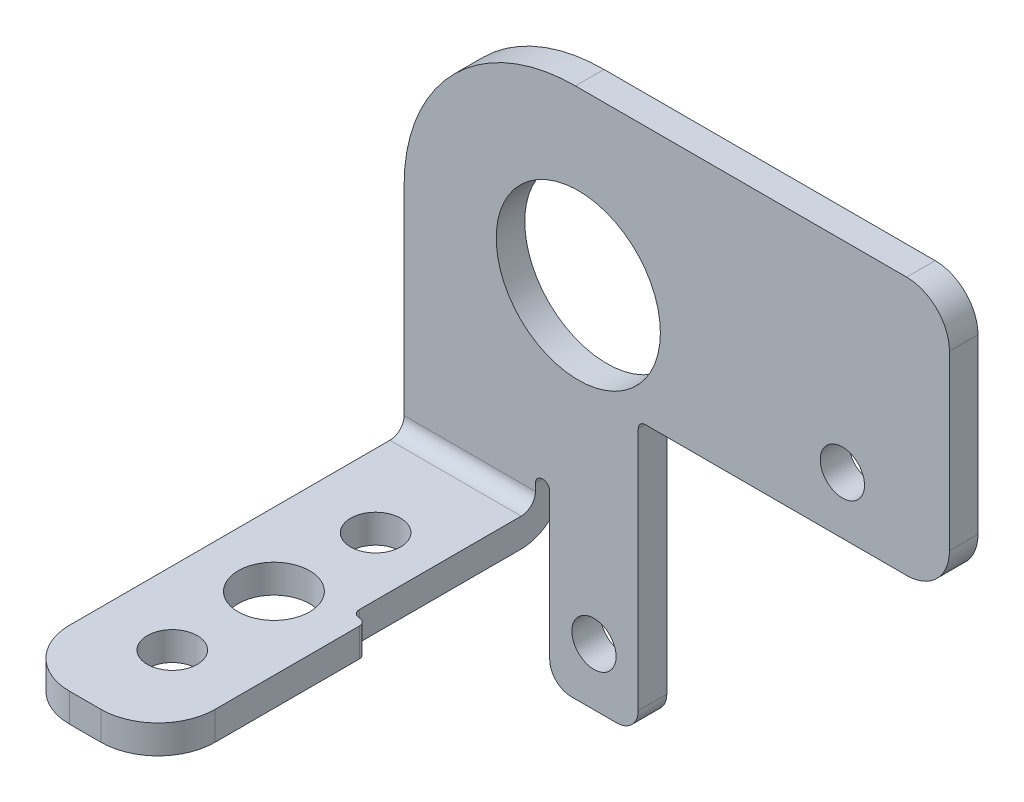
ISO-10303-21;
HEADER;
FILE_DESCRIPTION(('STEP AP214'),'2;1');
FILE_NAME('part.step','',(''),(''),'','','');
FILE_SCHEMA(('AUTOMOTIVE_DESIGN { 1 0 10303 214 1 1 1 1 }'));
ENDSEC;
DATA;
#1=APPLICATION_CONTEXT('core data for automotive mechanical design processes');
#2=APPLICATION_PROTOCOL_DEFINITION('international standard','automotive_design',2000,#1);
#3=PRODUCT_CONTEXT('',#1,'mechanical');
#4=PRODUCT('Part','Part','',(#3));
#5=PRODUCT_RELATED_PRODUCT_CATEGORY('part','',(#4));
#6=PRODUCT_DEFINITION_FORMATION('','',#4);
#7=PRODUCT_DEFINITION_CONTEXT('part definition',#1,'design');
#8=PRODUCT_DEFINITION('design','',#6,#7);
#9=PRODUCT_DEFINITION_SHAPE('','',#8);
#10=(LENGTH_UNIT() NAMED_UNIT(*) SI_UNIT(.MILLI.,.METRE.));
#11=(NAMED_UNIT(*) PLANE_ANGLE_UNIT() SI_UNIT($,.RADIAN.));
#12=(NAMED_UNIT(*) SI_UNIT($,.STERADIAN.) SOLID_ANGLE_UNIT());
#13=UNCERTAINTY_MEASURE_WITH_UNIT(LENGTH_MEASURE(1.E-05),#10,'distance_accuracy_value','');
#14=(GEOMETRIC_REPRESENTATION_CONTEXT(3) GLOBAL_UNCERTAINTY_ASSIGNED_CONTEXT((#13)) GLOBAL_UNIT_ASSIGNED_CONTEXT((#10,
#11,#12)) REPRESENTATION_CONTEXT('',''));
#15=CARTESIAN_POINT('',(0.,0.,0.));
#16=DIRECTION('',(0.,0.,1.));
#17=DIRECTION('',(1.,0.,0.));
#18=AXIS2_PLACEMENT_3D('',#15,#16,#17);
#19=CARTESIAN_POINT('',(0.,-18.1,2.));
#20=DIRECTION('',(-1.,0.,0.));
#21=DIRECTION('',(0.,0.,1.));
#22=AXIS2_PLACEMENT_3D('',#19,#20,#21);
#23=PLANE('',#22);
#24=DIRECTION('',(0.,1.,0.));
#25=VECTOR('',#24,1.);
#26=CARTESIAN_POINT('',(0.,-18.1,2.));
#27=LINE('',#26,#25);
#28=CARTESIAN_POINT('',(0.,-15.1,2.));
#29=VERTEX_POINT('',#28);
#30=CARTESIAN_POINT('',(0.,-3.,2.));
#31=VERTEX_POINT('',#30);
#32=EDGE_CURVE('E261',#29,#31,#27,.T.);
#33=ORIENTED_EDGE('',*,*,#32,.F.);
#34=DIRECTION('',(0.,0.,-1.));
#35=VECTOR('',#34,1.);
#36=CARTESIAN_POINT('',(0.,-15.1,2.));
#37=LINE('',#36,#35);
#38=CARTESIAN_POINT('',(0.,-15.1,0.));
#39=VERTEX_POINT('',#38);
#40=EDGE_CURVE('E323',#29,#39,#37,.T.);
#41=ORIENTED_EDGE('',*,*,#40,.T.);
#42=DIRECTION('',(0.,1.,0.));
#43=VECTOR('',#42,1.);
#44=CARTESIAN_POINT('',(0.,-18.1,0.));
#45=LINE('',#44,#43);
#46=CARTESIAN_POINT('',(0.,-3.,0.));
#47=VERTEX_POINT('',#46);
#48=EDGE_CURVE('E249',#39,#47,#45,.T.);
#49=ORIENTED_EDGE('',*,*,#48,.T.);
#50=DIRECTION('',(0.,0.,-1.));
#51=VECTOR('',#50,1.);
#52=CARTESIAN_POINT('',(0.,-3.,2.));
#53=LINE('',#52,#51);
#54=EDGE_CURVE('E293',#47,#31,#53,.F.);
#55=ORIENTED_EDGE('',*,*,#54,.T.);
#56=EDGE_LOOP('',(#33,#41,#49,#55));
#57=FACE_BOUND('',#56,.T.);
#58=ADVANCED_FACE('F38',(#57),#23,.F.);
#59=CARTESIAN_POINT('',(0.,0.,2.));
#60=DIRECTION('',(0.,-1.,0.));
#61=DIRECTION('',(1.,0.,0.));
#62=AXIS2_PLACEMENT_3D('',#59,#60,#61);
#63=PLANE('',#62);
#64=DIRECTION('',(-1.,0.,0.));
#65=VECTOR('',#64,1.);
#66=CARTESIAN_POINT('',(0.,0.,0.));
#67=LINE('',#66,#65);
#68=CARTESIAN_POINT('',(-3.,0.,0.));
#69=VERTEX_POINT('',#68);
#70=CARTESIAN_POINT('',(-26.2,0.,0.));
#71=VERTEX_POINT('',#70);
#72=EDGE_CURVE('E297',#69,#71,#67,.T.);
#73=ORIENTED_EDGE('',*,*,#72,.T.);
#74=DIRECTION('',(0.,0.,-1.));
#75=VECTOR('',#74,1.);
#76=CARTESIAN_POINT('',(-26.2,0.,2.));
#77=LINE('',#76,#75);
#78=CARTESIAN_POINT('',(-26.2,0.,2.));
#79=VERTEX_POINT('',#78);
#80=EDGE_CURVE('E355',#71,#79,#77,.F.);
#81=ORIENTED_EDGE('',*,*,#80,.T.);
#82=DIRECTION('',(-1.,0.,0.));
#83=VECTOR('',#82,1.);
#84=CARTESIAN_POINT('',(0.,0.,2.));
#85=LINE('',#84,#83);
#86=CARTESIAN_POINT('',(-3.,0.,2.));
#87=VERTEX_POINT('',#86);
#88=EDGE_CURVE('E265',#87,#79,#85,.T.);
#89=ORIENTED_EDGE('',*,*,#88,.F.);
#90=DIRECTION('',(0.,0.,-1.));
#91=VECTOR('',#90,1.);
#92=CARTESIAN_POINT('',(-3.,0.,2.));
#93=LINE('',#92,#91);
#94=EDGE_CURVE('E344',#87,#69,#93,.T.);
#95=ORIENTED_EDGE('',*,*,#94,.T.);
#96=EDGE_LOOP('',(#73,#81,#89,#95));
#97=FACE_BOUND('',#96,.T.);
#98=ADVANCED_FACE('F494',(#97),#63,.F.);
#99=CARTESIAN_POINT('',(-38.2,0.,2.));
#100=DIRECTION('',(1.,0.,0.));
#101=DIRECTION('',(0.,0.,-1.));
#102=AXIS2_PLACEMENT_3D('',#99,#100,#101);
#103=PLANE('',#102);
#104=DIRECTION('',(0.,0.,-1.));
#105=VECTOR('',#104,1.);
#106=CARTESIAN_POINT('',(-38.2,-29.,14.84));
#107=LINE('',#106,#105);
#108=CARTESIAN_POINT('',(-38.2,-29.,25.44));
#109=VERTEX_POINT('',#108);
#110=CARTESIAN_POINT('',(-38.2,-29.,3.));
#111=VERTEX_POINT('',#110);
#112=EDGE_CURVE('E225',#109,#111,#107,.T.);
#113=ORIENTED_EDGE('',*,*,#112,.F.);
#114=DIRECTION('',(0.,1.,0.));
#115=VECTOR('',#114,1.);
#116=CARTESIAN_POINT('',(-38.2,-27.,25.44));
#117=LINE('',#116,#115);
#118=CARTESIAN_POINT('',(-38.2,-27.,25.44));
#119=VERTEX_POINT('',#118);
#120=EDGE_CURVE('E432',#109,#119,#117,.T.);
#121=ORIENTED_EDGE('',*,*,#120,.T.);
#122=DIRECTION('',(0.,0.,-1.));
#123=VECTOR('',#122,1.);
#124=CARTESIAN_POINT('',(-38.2,-27.,14.84));
#125=LINE('',#124,#123);
#126=CARTESIAN_POINT('',(-38.2,-27.,2.99999999999999));
#127=VERTEX_POINT('',#126);
#128=EDGE_CURVE('E507',#119,#127,#125,.T.);
#129=ORIENTED_EDGE('',*,*,#128,.T.);
#130=CARTESIAN_POINT('',(-38.2,-26.,3.));
#131=DIRECTION('',(1.,0.,0.));
#132=DIRECTION('',(0.,0.,1.));
#133=AXIS2_PLACEMENT_3D('',#130,#131,#132);
#134=CIRCLE('',#133,0.999999999999999);
#135=CARTESIAN_POINT('',(-38.2,-26.,2.));
#136=VERTEX_POINT('',#135);
#137=EDGE_CURVE('E255',#127,#136,#134,.T.);
#138=ORIENTED_EDGE('',*,*,#137,.T.);
#139=DIRECTION('',(0.,-1.,0.));
#140=VECTOR('',#139,1.);
#141=CARTESIAN_POINT('',(-38.2,0.,2.));
#142=LINE('',#141,#140);
#143=CARTESIAN_POINT('',(-38.2,-12.,2.));
#144=VERTEX_POINT('',#143);
#145=EDGE_CURVE('E270',#144,#136,#142,.T.);
#146=ORIENTED_EDGE('',*,*,#145,.F.);
#147=DIRECTION('',(0.,0.,-1.));
#148=VECTOR('',#147,1.);
#149=CARTESIAN_POINT('',(-38.2,-12.,2.));
#150=LINE('',#149,#148);
#151=CARTESIAN_POINT('',(-38.2,-12.,0.));
#152=VERTEX_POINT('',#151);
#153=EDGE_CURVE('E348',#144,#152,#150,.T.);
#154=ORIENTED_EDGE('',*,*,#153,.T.);
#155=DIRECTION('',(0.,-1.,0.));
#156=VECTOR('',#155,1.);
#157=CARTESIAN_POINT('',(-38.2,0.,0.));
#158=LINE('',#157,#156);
#159=CARTESIAN_POINT('',(-38.2,-26.,0.));
#160=VERTEX_POINT('',#159);
#161=EDGE_CURVE('E301',#152,#160,#158,.T.);
#162=ORIENTED_EDGE('',*,*,#161,.T.);
#163=CARTESIAN_POINT('',(-38.2,-26.,3.));
#164=DIRECTION('',(-1.,0.,0.));
#165=DIRECTION('',(0.,0.,1.));
#166=AXIS2_PLACEMENT_3D('',#163,#164,#165);
#167=CIRCLE('',#166,3.);
#168=EDGE_CURVE('E238',#160,#111,#167,.T.);
#169=ORIENTED_EDGE('',*,*,#168,.T.);
#170=EDGE_LOOP('',(#113,#121,#129,#138,#146,#154,#162,#169));
#171=FACE_BOUND('',#170,.T.);
#172=ADVANCED_FACE('F503',(#171),#103,.F.);
#173=CARTESIAN_POINT('',(-29.,-26.,2.));
#174=DIRECTION('',(-1.,0.,0.));
#175=DIRECTION('',(0.,0.,1.));
#176=AXIS2_PLACEMENT_3D('',#173,#174,#175);
#177=PLANE('',#176);
#178=DIRECTION('',(0.,0.,-1.));
#179=VECTOR('',#178,1.);
#180=CARTESIAN_POINT('',(-29.,-27.,14.84));
#181=LINE('',#180,#179);
#182=CARTESIAN_POINT('',(-29.,-27.,14.34));
#183=VERTEX_POINT('',#182);
#184=CARTESIAN_POINT('',(-29.,-27.,2.99999999999999));
#185=VERTEX_POINT('',#184);
#186=EDGE_CURVE('E226',#183,#185,#181,.T.);
#187=ORIENTED_EDGE('',*,*,#186,.F.);
#188=DIRECTION('',(0.,1.,0.));
#189=VECTOR('',#188,1.);
#190=CARTESIAN_POINT('',(-29.,-26.,14.34));
#191=LINE('',#190,#189);
#192=CARTESIAN_POINT('',(-29.,-29.,14.34));
#193=VERTEX_POINT('',#192);
#194=EDGE_CURVE('E221',#183,#193,#191,.F.);
#195=ORIENTED_EDGE('',*,*,#194,.T.);
#196=DIRECTION('',(0.,0.,-1.));
#197=VECTOR('',#196,1.);
#198=CARTESIAN_POINT('',(-29.,-29.,14.84));
#199=LINE('',#198,#197);
#200=CARTESIAN_POINT('',(-29.,-29.,2.99999999999999));
#201=VERTEX_POINT('',#200);
#202=EDGE_CURVE('E212',#193,#201,#199,.T.);
#203=ORIENTED_EDGE('',*,*,#202,.T.);
#204=CARTESIAN_POINT('',(-29.,-26.,3.));
#205=DIRECTION('',(-1.,0.,0.));
#206=DIRECTION('',(0.,0.,1.));
#207=AXIS2_PLACEMENT_3D('',#204,#205,#206);
#208=CIRCLE('',#207,3.);
#209=CARTESIAN_POINT('',(-29.,-26.,0.));
#210=VERTEX_POINT('',#209);
#211=EDGE_CURVE('E218',#201,#210,#208,.F.);
#212=ORIENTED_EDGE('',*,*,#211,.T.);
#213=DIRECTION('',(0.,1.,0.));
#214=VECTOR('',#213,1.);
#215=CARTESIAN_POINT('',(-29.,-26.,0.));
#216=LINE('',#215,#214);
#217=CARTESIAN_POINT('',(-29.,-25.5,0.));
#218=VERTEX_POINT('',#217);
#219=EDGE_CURVE('E306',#210,#218,#216,.T.);
#220=ORIENTED_EDGE('',*,*,#219,.T.);
#221=DIRECTION('',(0.,0.,-1.));
#222=VECTOR('',#221,1.);
#223=CARTESIAN_POINT('',(-29.,-25.5,2.));
#224=LINE('',#223,#222);
#225=CARTESIAN_POINT('',(-29.,-25.5,2.));
#226=VERTEX_POINT('',#225);
#227=EDGE_CURVE('E393',#218,#226,#224,.F.);
#228=ORIENTED_EDGE('',*,*,#227,.T.);
#229=DIRECTION('',(0.,1.,0.));
#230=VECTOR('',#229,1.);
#231=CARTESIAN_POINT('',(-29.,-26.,2.));
#232=LINE('',#231,#230);
#233=CARTESIAN_POINT('',(-29.,-26.,2.));
#234=VERTEX_POINT('',#233);
#235=EDGE_CURVE('E276',#234,#226,#232,.T.);
#236=ORIENTED_EDGE('',*,*,#235,.F.);
#237=CARTESIAN_POINT('',(-29.,-26.,3.));
#238=DIRECTION('',(-1.,0.,0.));
#239=DIRECTION('',(0.,0.,1.));
#240=AXIS2_PLACEMENT_3D('',#237,#238,#239);
#241=CIRCLE('',#240,0.999999999999999);
#242=EDGE_CURVE('E244',#234,#185,#241,.T.);
#243=ORIENTED_EDGE('',*,*,#242,.T.);
#244=EDGE_LOOP('',(#187,#195,#203,#212,#220,#228,#236,#243));
#245=FACE_BOUND('',#244,.T.);
#246=ADVANCED_FACE('F215',(#245),#177,.F.);
#247=CARTESIAN_POINT('',(-28.,-25.,2.));
#248=DIRECTION('',(1.,0.,0.));
#249=DIRECTION('',(0.,0.,-1.));
#250=AXIS2_PLACEMENT_3D('',#247,#248,#249);
#251=PLANE('',#250);
#252=DIRECTION('',(0.,-1.,0.));
#253=VECTOR('',#252,1.);
#254=CARTESIAN_POINT('',(-28.,-25.,2.));
#255=LINE('',#254,#253);
#256=CARTESIAN_POINT('',(-28.,-25.5,2.));
#257=VERTEX_POINT('',#256);
#258=CARTESIAN_POINT('',(-28.,-35.7,2.));
#259=VERTEX_POINT('',#258);
#260=EDGE_CURVE('E280',#257,#259,#255,.T.);
#261=ORIENTED_EDGE('',*,*,#260,.F.);
#262=DIRECTION('',(0.,0.,-1.));
#263=VECTOR('',#262,1.);
#264=CARTESIAN_POINT('',(-28.,-25.5,0.));
#265=LINE('',#264,#263);
#266=CARTESIAN_POINT('',(-28.,-25.5,0.));
#267=VERTEX_POINT('',#266);
#268=EDGE_CURVE('E389',#257,#267,#265,.T.);
#269=ORIENTED_EDGE('',*,*,#268,.T.);
#270=DIRECTION('',(0.,-1.,0.));
#271=VECTOR('',#270,1.);
#272=CARTESIAN_POINT('',(-28.,-25.,0.));
#273=LINE('',#272,#271);
#274=CARTESIAN_POINT('',(-28.,-35.7,0.));
#275=VERTEX_POINT('',#274);
#276=EDGE_CURVE('E309',#267,#275,#273,.T.);
#277=ORIENTED_EDGE('',*,*,#276,.T.);
#278=DIRECTION('',(0.,0.,-1.));
#279=VECTOR('',#278,1.);
#280=CARTESIAN_POINT('',(-28.,-35.7,2.));
#281=LINE('',#280,#279);
#282=EDGE_CURVE('E375',#275,#259,#281,.F.);
#283=ORIENTED_EDGE('',*,*,#282,.T.);
#284=EDGE_LOOP('',(#261,#269,#277,#283));
#285=FACE_BOUND('',#284,.T.);
#286=ADVANCED_FACE('F524',(#285),#251,.F.);
#287=CARTESIAN_POINT('',(-28.,-37.2,2.));
#288=DIRECTION('',(0.,1.,0.));
#289=DIRECTION('',(0.,0.,1.));
#290=AXIS2_PLACEMENT_3D('',#287,#288,#289);
#291=PLANE('',#290);
#292=DIRECTION('',(1.,0.,0.));
#293=VECTOR('',#292,1.);
#294=CARTESIAN_POINT('',(-28.,-37.2,2.));
#295=LINE('',#294,#293);
#296=CARTESIAN_POINT('',(-26.5,-37.2,2.));
#297=VERTEX_POINT('',#296);
#298=CARTESIAN_POINT('',(-23.3,-37.2,2.));
#299=VERTEX_POINT('',#298);
#300=EDGE_CURVE('E283',#297,#299,#295,.T.);
#301=ORIENTED_EDGE('',*,*,#300,.F.);
#302=DIRECTION('',(0.,0.,-1.));
#303=VECTOR('',#302,1.);
#304=CARTESIAN_POINT('',(-26.5,-37.2,2.));
#305=LINE('',#304,#303);
#306=CARTESIAN_POINT('',(-26.5,-37.2,0.));
#307=VERTEX_POINT('',#306);
#308=EDGE_CURVE('E364',#297,#307,#305,.T.);
#309=ORIENTED_EDGE('',*,*,#308,.T.);
#310=DIRECTION('',(1.,0.,0.));
#311=VECTOR('',#310,1.);
#312=CARTESIAN_POINT('',(-28.,-37.2,0.));
#313=LINE('',#312,#311);
#314=CARTESIAN_POINT('',(-23.3,-37.2,0.));
#315=VERTEX_POINT('',#314);
#316=EDGE_CURVE('E312',#307,#315,#313,.T.);
#317=ORIENTED_EDGE('',*,*,#316,.T.);
#318=DIRECTION('',(0.,0.,-1.));
#319=VECTOR('',#318,1.);
#320=CARTESIAN_POINT('',(-23.3,-37.2,2.));
#321=LINE('',#320,#319);
#322=EDGE_CURVE('E361',#315,#299,#321,.F.);
#323=ORIENTED_EDGE('',*,*,#322,.T.);
#324=EDGE_LOOP('',(#301,#309,#317,#323));
#325=FACE_BOUND('',#324,.T.);
#326=ADVANCED_FACE('F535',(#325),#291,.F.);
#327=CARTESIAN_POINT('',(-21.8,-37.2,2.));
#328=DIRECTION('',(-1.,0.,0.));
#329=DIRECTION('',(0.,-1.,0.));
#330=AXIS2_PLACEMENT_3D('',#327,#328,#329);
#331=PLANE('',#330);
#332=DIRECTION('',(0.,1.,0.));
#333=VECTOR('',#332,1.);
#334=CARTESIAN_POINT('',(-21.8,-37.2,0.));
#335=LINE('',#334,#333);
#336=CARTESIAN_POINT('',(-21.8,-35.7,0.));
#337=VERTEX_POINT('',#336);
#338=CARTESIAN_POINT('',(-21.8,-18.6,0.));
#339=VERTEX_POINT('',#338);
#340=EDGE_CURVE('E316',#337,#339,#335,.T.);
#341=ORIENTED_EDGE('',*,*,#340,.T.);
#342=DIRECTION('',(0.,0.,-1.));
#343=VECTOR('',#342,1.);
#344=CARTESIAN_POINT('',(-21.8,-18.6,2.));
#345=LINE('',#344,#343);
#346=CARTESIAN_POINT('',(-21.8,-18.6,2.));
#347=VERTEX_POINT('',#346);
#348=EDGE_CURVE('E60',#339,#347,#345,.F.);
#349=ORIENTED_EDGE('',*,*,#348,.T.);
#350=DIRECTION('',(0.,1.,0.));
#351=VECTOR('',#350,1.);
#352=CARTESIAN_POINT('',(-21.8,-37.2,2.));
#353=LINE('',#352,#351);
#354=CARTESIAN_POINT('',(-21.8,-35.7,2.));
#355=VERTEX_POINT('',#354);
#356=EDGE_CURVE('E287',#355,#347,#353,.T.);
#357=ORIENTED_EDGE('',*,*,#356,.F.);
#358=DIRECTION('',(0.,0.,-1.));
#359=VECTOR('',#358,1.);
#360=CARTESIAN_POINT('',(-21.8,-35.7,2.));
#361=LINE('',#360,#359);
#362=EDGE_CURVE('E385',#355,#337,#361,.T.);
#363=ORIENTED_EDGE('',*,*,#362,.T.);
#364=EDGE_LOOP('',(#341,#349,#357,#363));
#365=FACE_BOUND('',#364,.T.);
#366=ADVANCED_FACE('F540',(#365),#331,.F.);
#367=CARTESIAN_POINT('',(-21.8,-18.1,2.));
#368=DIRECTION('',(0.,1.,0.));
#369=DIRECTION('',(-1.,0.,0.));
#370=AXIS2_PLACEMENT_3D('',#367,#368,#369);
#371=PLANE('',#370);
#372=DIRECTION('',(1.,0.,0.));
#373=VECTOR('',#372,1.);
#374=CARTESIAN_POINT('',(-21.8,-18.1,2.));
#375=LINE('',#374,#373);
#376=CARTESIAN_POINT('',(-21.3,-18.1,2.));
#377=VERTEX_POINT('',#376);
#378=CARTESIAN_POINT('',(-3.,-18.1,2.));
#379=VERTEX_POINT('',#378);
#380=EDGE_CURVE('E290',#377,#379,#375,.T.);
#381=ORIENTED_EDGE('',*,*,#380,.F.);
#382=DIRECTION('',(0.,0.,-1.));
#383=VECTOR('',#382,1.);
#384=CARTESIAN_POINT('',(-21.3,-18.1,0.));
#385=LINE('',#384,#383);
#386=CARTESIAN_POINT('',(-21.3,-18.1,0.));
#387=VERTEX_POINT('',#386);
#388=EDGE_CURVE('E462',#377,#387,#385,.T.);
#389=ORIENTED_EDGE('',*,*,#388,.T.);
#390=DIRECTION('',(1.,0.,0.));
#391=VECTOR('',#390,1.);
#392=CARTESIAN_POINT('',(-21.8,-18.1,0.));
#393=LINE('',#392,#391);
#394=CARTESIAN_POINT('',(-3.,-18.1,0.));
#395=VERTEX_POINT('',#394);
#396=EDGE_CURVE('E266',#387,#395,#393,.T.);
#397=ORIENTED_EDGE('',*,*,#396,.T.);
#398=DIRECTION('',(0.,0.,-1.));
#399=VECTOR('',#398,1.);
#400=CARTESIAN_POINT('',(-3.,-18.1,2.));
#401=LINE('',#400,#399);
#402=EDGE_CURVE('E334',#395,#379,#401,.F.);
#403=ORIENTED_EDGE('',*,*,#402,.T.);
#404=EDGE_LOOP('',(#381,#389,#397,#403));
#405=FACE_BOUND('',#404,.T.);
#406=ADVANCED_FACE('F471',(#405),#371,.F.);
#407=CARTESIAN_POINT('',(0.,0.,2.));
#408=DIRECTION('',(0.,0.,1.));
#409=DIRECTION('',(1.,0.,0.));
#410=AXIS2_PLACEMENT_3D('',#407,#408,#409);
#411=PLANE('',#410);
#412=CARTESIAN_POINT('',(-26.,-12.,2.));
#413=DIRECTION('',(0.,0.,1.));
#414=DIRECTION('',(1.,0.,0.));
#415=AXIS2_PLACEMENT_3D('',#412,#413,#414);
#416=CIRCLE('',#415,5.75);
#417=CARTESIAN_POINT('',(-20.25,-12.,2.));
#418=VERTEX_POINT('',#417);
#419=EDGE_CURVE('E631',#418,#418,#416,.T.);
#420=ORIENTED_EDGE('',*,*,#419,.F.);
#421=EDGE_LOOP('',(#420));
#422=FACE_BOUND('',#421,.T.);
#423=CARTESIAN_POINT('',(-7.5,-14.1,2.));
#424=DIRECTION('',(0.,0.,1.));
#425=DIRECTION('',(1.,0.,0.));
#426=AXIS2_PLACEMENT_3D('',#423,#424,#425);
#427=CIRCLE('',#426,1.55);
#428=CARTESIAN_POINT('',(-5.95,-14.1,2.));
#429=VERTEX_POINT('',#428);
#430=EDGE_CURVE('E617',#429,#429,#427,.T.);
#431=ORIENTED_EDGE('',*,*,#430,.F.);
#432=EDGE_LOOP('',(#431));
#433=FACE_BOUND('',#432,.T.);
#434=CARTESIAN_POINT('',(-24.9,-33.2,2.));
#435=DIRECTION('',(0.,0.,1.));
#436=DIRECTION('',(1.,0.,0.));
#437=AXIS2_PLACEMENT_3D('',#434,#435,#436);
#438=CIRCLE('',#437,1.55);
#439=CARTESIAN_POINT('',(-23.35,-33.2,2.));
#440=VERTEX_POINT('',#439);
#441=EDGE_CURVE('E413',#440,#440,#438,.T.);
#442=ORIENTED_EDGE('',*,*,#441,.F.);
#443=EDGE_LOOP('',(#442));
#444=FACE_BOUND('',#443,.T.);
#445=ORIENTED_EDGE('',*,*,#235,.T.);
#446=CARTESIAN_POINT('',(-28.5,-25.5,2.));
#447=DIRECTION('',(0.,0.,1.));
#448=DIRECTION('',(1.,0.,0.));
#449=AXIS2_PLACEMENT_3D('',#446,#447,#448);
#450=CIRCLE('',#449,0.5);
#451=CARTESIAN_POINT('',(-28.5,-25.,2.));
#452=VERTEX_POINT('',#451);
#453=EDGE_CURVE('E405',#226,#452,#450,.F.);
#454=ORIENTED_EDGE('',*,*,#453,.T.);
#455=CARTESIAN_POINT('',(-28.5,-25.5,2.));
#456=DIRECTION('',(0.,0.,1.));
#457=DIRECTION('',(1.,0.,0.));
#458=AXIS2_PLACEMENT_3D('',#455,#456,#457);
#459=CIRCLE('',#458,0.5);
#460=EDGE_CURVE('E399',#452,#257,#459,.F.);
#461=ORIENTED_EDGE('',*,*,#460,.T.);
#462=ORIENTED_EDGE('',*,*,#260,.T.);
#463=CARTESIAN_POINT('',(-26.5,-35.7,2.));
#464=DIRECTION('',(0.,0.,1.));
#465=DIRECTION('',(1.,0.,0.));
#466=AXIS2_PLACEMENT_3D('',#463,#464,#465);
#467=CIRCLE('',#466,1.5);
#468=EDGE_CURVE('E382',#259,#297,#467,.T.);
#469=ORIENTED_EDGE('',*,*,#468,.T.);
#470=ORIENTED_EDGE('',*,*,#300,.T.);
#471=CARTESIAN_POINT('',(-23.3,-35.7,2.));
#472=DIRECTION('',(0.,0.,1.));
#473=DIRECTION('',(1.,0.,0.));
#474=AXIS2_PLACEMENT_3D('',#471,#472,#473);
#475=CIRCLE('',#474,1.5);
#476=EDGE_CURVE('E379',#299,#355,#475,.T.);
#477=ORIENTED_EDGE('',*,*,#476,.T.);
#478=ORIENTED_EDGE('',*,*,#356,.T.);
#479=CARTESIAN_POINT('',(-21.3,-18.6,2.));
#480=DIRECTION('',(0.,0.,1.));
#481=DIRECTION('',(1.,0.,0.));
#482=AXIS2_PLACEMENT_3D('',#479,#480,#481);
#483=CIRCLE('',#482,0.5);
#484=EDGE_CURVE('E11',#347,#377,#483,.F.);
#485=ORIENTED_EDGE('',*,*,#484,.T.);
#486=ORIENTED_EDGE('',*,*,#380,.T.);
#487=CARTESIAN_POINT('',(-3.,-15.1,2.));
#488=DIRECTION('',(0.,0.,1.));
#489=DIRECTION('',(1.,0.,0.));
#490=AXIS2_PLACEMENT_3D('',#487,#488,#489);
#491=CIRCLE('',#490,3.);
#492=EDGE_CURVE('E341',#379,#29,#491,.T.);
#493=ORIENTED_EDGE('',*,*,#492,.T.);
#494=ORIENTED_EDGE('',*,*,#32,.T.);
#495=CARTESIAN_POINT('',(-3.,-3.,2.));
#496=DIRECTION('',(0.,0.,1.));
#497=DIRECTION('',(1.,0.,0.));
#498=AXIS2_PLACEMENT_3D('',#495,#496,#497);
#499=CIRCLE('',#498,3.);
#500=EDGE_CURVE('E338',#31,#87,#499,.T.);
#501=ORIENTED_EDGE('',*,*,#500,.T.);
#502=ORIENTED_EDGE('',*,*,#88,.T.);
#503=CARTESIAN_POINT('',(-26.2,-12.,2.));
#504=DIRECTION('',(0.,0.,1.));
#505=DIRECTION('',(1.,0.,0.));
#506=AXIS2_PLACEMENT_3D('',#503,#504,#505);
#507=CIRCLE('',#506,12.);
#508=EDGE_CURVE('E358',#79,#144,#507,.T.);
#509=ORIENTED_EDGE('',*,*,#508,.T.);
#510=ORIENTED_EDGE('',*,*,#145,.T.);
#511=DIRECTION('',(1.,0.,0.));
#512=VECTOR('',#511,1.);
#513=CARTESIAN_POINT('',(-38.2,-26.,2.));
#514=LINE('',#513,#512);
#515=EDGE_CURVE('E273',#136,#234,#514,.T.);
#516=ORIENTED_EDGE('',*,*,#515,.T.);
#517=EDGE_LOOP('',(#445,#454,#461,#462,#469,#470,#477,#478,#485,#486,#493,#494,#501,#502,#509,
#510,#516));
#518=FACE_BOUND('',#517,.T.);
#519=ADVANCED_FACE('F484',(#422,#433,#444,#518),#411,.T.);
#520=CARTESIAN_POINT('',(0.,0.,0.));
#521=DIRECTION('',(0.,0.,1.));
#522=DIRECTION('',(1.,0.,0.));
#523=AXIS2_PLACEMENT_3D('',#520,#521,#522);
#524=PLANE('',#523);
#525=CARTESIAN_POINT('',(-26.,-12.,0.));
#526=DIRECTION('',(0.,0.,1.));
#527=DIRECTION('',(1.,0.,0.));
#528=AXIS2_PLACEMENT_3D('',#525,#526,#527);
#529=CIRCLE('',#528,5.75);
#530=CARTESIAN_POINT('',(-20.25,-12.,0.));
#531=VERTEX_POINT('',#530);
#532=EDGE_CURVE('E436',#531,#531,#529,.T.);
#533=ORIENTED_EDGE('',*,*,#532,.T.);
#534=EDGE_LOOP('',(#533));
#535=FACE_BOUND('',#534,.T.);
#536=CARTESIAN_POINT('',(-7.5,-14.1,0.));
#537=DIRECTION('',(0.,0.,1.));
#538=DIRECTION('',(1.,0.,0.));
#539=AXIS2_PLACEMENT_3D('',#536,#537,#538);
#540=CIRCLE('',#539,1.55);
#541=CARTESIAN_POINT('',(-5.95,-14.1,0.));
#542=VERTEX_POINT('',#541);
#543=EDGE_CURVE('E613',#542,#542,#540,.T.);
#544=ORIENTED_EDGE('',*,*,#543,.T.);
#545=EDGE_LOOP('',(#544));
#546=FACE_BOUND('',#545,.T.);
#547=CARTESIAN_POINT('',(-24.9,-33.2,0.));
#548=DIRECTION('',(0.,0.,1.));
#549=DIRECTION('',(1.,0.,0.));
#550=AXIS2_PLACEMENT_3D('',#547,#548,#549);
#551=CIRCLE('',#550,1.55);
#552=CARTESIAN_POINT('',(-23.35,-33.2,0.));
#553=VERTEX_POINT('',#552);
#554=EDGE_CURVE('E621',#553,#553,#551,.T.);
#555=ORIENTED_EDGE('',*,*,#554,.T.);
#556=EDGE_LOOP('',(#555));
#557=FACE_BOUND('',#556,.T.);
#558=ORIENTED_EDGE('',*,*,#316,.F.);
#559=CARTESIAN_POINT('',(-26.5,-35.7,0.));
#560=DIRECTION('',(0.,0.,1.));
#561=DIRECTION('',(1.,0.,0.));
#562=AXIS2_PLACEMENT_3D('',#559,#560,#561);
#563=CIRCLE('',#562,1.5);
#564=EDGE_CURVE('E371',#307,#275,#563,.F.);
#565=ORIENTED_EDGE('',*,*,#564,.T.);
#566=ORIENTED_EDGE('',*,*,#276,.F.);
#567=CARTESIAN_POINT('',(-28.5,-25.5,0.));
#568=DIRECTION('',(0.,0.,1.));
#569=DIRECTION('',(1.,0.,0.));
#570=AXIS2_PLACEMENT_3D('',#567,#568,#569);
#571=CIRCLE('',#570,0.5);
#572=CARTESIAN_POINT('',(-28.5,-25.,0.));
#573=VERTEX_POINT('',#572);
#574=EDGE_CURVE('E396',#267,#573,#571,.T.);
#575=ORIENTED_EDGE('',*,*,#574,.T.);
#576=CARTESIAN_POINT('',(-28.5,-25.5,0.));
#577=DIRECTION('',(0.,0.,1.));
#578=DIRECTION('',(1.,0.,0.));
#579=AXIS2_PLACEMENT_3D('',#576,#577,#578);
#580=CIRCLE('',#579,0.5);
#581=EDGE_CURVE('E402',#573,#218,#580,.T.);
#582=ORIENTED_EDGE('',*,*,#581,.T.);
#583=ORIENTED_EDGE('',*,*,#219,.F.);
#584=DIRECTION('',(1.,0.,0.));
#585=VECTOR('',#584,1.);
#586=CARTESIAN_POINT('',(-38.2,-26.,0.));
#587=LINE('',#586,#585);
#588=EDGE_CURVE('E242',#160,#210,#587,.T.);
#589=ORIENTED_EDGE('',*,*,#588,.F.);
#590=ORIENTED_EDGE('',*,*,#161,.F.);
#591=CARTESIAN_POINT('',(-26.2,-12.,0.));
#592=DIRECTION('',(0.,0.,1.));
#593=DIRECTION('',(1.,0.,0.));
#594=AXIS2_PLACEMENT_3D('',#591,#592,#593);
#595=CIRCLE('',#594,12.);
#596=EDGE_CURVE('E352',#152,#71,#595,.F.);
#597=ORIENTED_EDGE('',*,*,#596,.T.);
#598=ORIENTED_EDGE('',*,*,#72,.F.);
#599=CARTESIAN_POINT('',(-3.,-3.,0.));
#600=DIRECTION('',(0.,0.,1.));
#601=DIRECTION('',(1.,0.,0.));
#602=AXIS2_PLACEMENT_3D('',#599,#600,#601);
#603=CIRCLE('',#602,3.);
#604=EDGE_CURVE('E327',#69,#47,#603,.F.);
#605=ORIENTED_EDGE('',*,*,#604,.T.);
#606=ORIENTED_EDGE('',*,*,#48,.F.);
#607=CARTESIAN_POINT('',(-3.,-15.1,0.));
#608=DIRECTION('',(0.,0.,1.));
#609=DIRECTION('',(1.,0.,0.));
#610=AXIS2_PLACEMENT_3D('',#607,#608,#609);
#611=CIRCLE('',#610,3.);
#612=EDGE_CURVE('E330',#39,#395,#611,.F.);
#613=ORIENTED_EDGE('',*,*,#612,.T.);
#614=ORIENTED_EDGE('',*,*,#396,.F.);
#615=CARTESIAN_POINT('',(-21.3,-18.6,0.));
#616=DIRECTION('',(0.,0.,1.));
#617=DIRECTION('',(1.,0.,0.));
#618=AXIS2_PLACEMENT_3D('',#615,#616,#617);
#619=CIRCLE('',#618,0.5);
#620=EDGE_CURVE('E47',#387,#339,#619,.T.);
#621=ORIENTED_EDGE('',*,*,#620,.T.);
#622=ORIENTED_EDGE('',*,*,#340,.F.);
#623=CARTESIAN_POINT('',(-23.3,-35.7,0.));
#624=DIRECTION('',(0.,0.,1.));
#625=DIRECTION('',(1.,0.,0.));
#626=AXIS2_PLACEMENT_3D('',#623,#624,#625);
#627=CIRCLE('',#626,1.5);
#628=EDGE_CURVE('E368',#337,#315,#627,.F.);
#629=ORIENTED_EDGE('',*,*,#628,.T.);
#630=EDGE_LOOP('',(#558,#565,#566,#575,#582,#583,#589,#590,#597,#598,#605,#606,#613,#614,#621,
#622,#629));
#631=FACE_BOUND('',#630,.T.);
#632=ADVANCED_FACE('F475',(#535,#546,#557,#631),#524,.F.);
#633=CARTESIAN_POINT('',(-24.7573593128807,-26.,3.));
#634=DIRECTION('',(-1.,0.,0.));
#635=DIRECTION('',(0.,0.,1.));
#636=AXIS2_PLACEMENT_3D('',#633,#634,#635);
#637=CYLINDRICAL_SURFACE('',#636,0.999999999999999);
#638=ORIENTED_EDGE('',*,*,#242,.F.);
#639=ORIENTED_EDGE('',*,*,#515,.F.);
#640=ORIENTED_EDGE('',*,*,#137,.F.);
#641=DIRECTION('',(-1.,0.,0.));
#642=VECTOR('',#641,1.);
#643=CARTESIAN_POINT('',(-24.7573593128807,-27.,3.));
#644=LINE('',#643,#642);
#645=EDGE_CURVE('E237',#185,#127,#644,.T.);
#646=ORIENTED_EDGE('',*,*,#645,.F.);
#647=EDGE_LOOP('',(#638,#639,#640,#646));
#648=FACE_BOUND('',#647,.T.);
#649=ADVANCED_FACE('F511',(#648),#637,.F.);
#650=CARTESIAN_POINT('',(-24.7573593128807,-26.,3.));
#651=DIRECTION('',(-1.,0.,0.));
#652=DIRECTION('',(0.,0.,1.));
#653=AXIS2_PLACEMENT_3D('',#650,#651,#652);
#654=CYLINDRICAL_SURFACE('',#653,3.);
#655=ORIENTED_EDGE('',*,*,#211,.F.);
#656=DIRECTION('',(-1.,0.,0.));
#657=VECTOR('',#656,1.);
#658=CARTESIAN_POINT('',(-24.7573593128807,-29.,3.));
#659=LINE('',#658,#657);
#660=EDGE_CURVE('E229',#201,#111,#659,.T.);
#661=ORIENTED_EDGE('',*,*,#660,.T.);
#662=ORIENTED_EDGE('',*,*,#168,.F.);
#663=ORIENTED_EDGE('',*,*,#588,.T.);
#664=EDGE_LOOP('',(#655,#661,#662,#663));
#665=FACE_BOUND('',#664,.T.);
#666=ADVANCED_FACE('F240',(#665),#654,.T.);
#667=CARTESIAN_POINT('',(-38.2,-29.,14.84));
#668=DIRECTION('',(0.,1.,0.));
#669=DIRECTION('',(0.,0.,1.));
#670=AXIS2_PLACEMENT_3D('',#667,#668,#669);
#671=PLANE('',#670);
#672=CARTESIAN_POINT('',(-33.1,-29.,23.3422083360282));
#673=DIRECTION('',(0.,1.,0.));
#674=DIRECTION('',(0.,0.,1.));
#675=AXIS2_PLACEMENT_3D('',#672,#673,#674);
#676=CIRCLE('',#675,1.75);
#677=CARTESIAN_POINT('',(-33.1,-29.,25.0922083360282));
#678=VERTEX_POINT('',#677);
#679=EDGE_CURVE('E635',#678,#678,#676,.T.);
#680=ORIENTED_EDGE('',*,*,#679,.T.);
#681=EDGE_LOOP('',(#680));
#682=FACE_BOUND('',#681,.T.);
#683=CARTESIAN_POINT('',(-33.1,-29.,9.09779166397181));
#684=DIRECTION('',(0.,1.,0.));
#685=DIRECTION('',(0.,0.,1.));
#686=AXIS2_PLACEMENT_3D('',#683,#684,#685);
#687=CIRCLE('',#686,1.75);
#688=CARTESIAN_POINT('',(-33.1,-29.,10.8477916639718));
#689=VERTEX_POINT('',#688);
#690=EDGE_CURVE('E639',#689,#689,#687,.T.);
#691=ORIENTED_EDGE('',*,*,#690,.T.);
#692=EDGE_LOOP('',(#691));
#693=FACE_BOUND('',#692,.T.);
#694=CARTESIAN_POINT('',(-33.1,-29.,16.22));
#695=DIRECTION('',(0.,1.,0.));
#696=DIRECTION('',(0.,0.,1.));
#697=AXIS2_PLACEMENT_3D('',#694,#695,#696);
#698=CIRCLE('',#697,2.5);
#699=CARTESIAN_POINT('',(-33.1,-29.,18.72));
#700=VERTEX_POINT('',#699);
#701=EDGE_CURVE('E643',#700,#700,#698,.T.);
#702=ORIENTED_EDGE('',*,*,#701,.T.);
#703=EDGE_LOOP('',(#702));
#704=FACE_BOUND('',#703,.T.);
#705=DIRECTION('',(-1.,0.,0.));
#706=VECTOR('',#705,1.);
#707=CARTESIAN_POINT('',(-38.2,-29.,29.44));
#708=LINE('',#707,#706);
#709=CARTESIAN_POINT('',(-32.,-29.,29.44));
#710=VERTEX_POINT('',#709);
#711=CARTESIAN_POINT('',(-34.2,-29.,29.44));
#712=VERTEX_POINT('',#711);
#713=EDGE_CURVE('E594',#710,#712,#708,.T.);
#714=ORIENTED_EDGE('',*,*,#713,.T.);
#715=CARTESIAN_POINT('',(-34.2,-29.,25.44));
#716=DIRECTION('',(0.,1.,0.));
#717=DIRECTION('',(0.,0.,1.));
#718=AXIS2_PLACEMENT_3D('',#715,#716,#717);
#719=CIRCLE('',#718,4.);
#720=EDGE_CURVE('E456',#712,#109,#719,.F.);
#721=ORIENTED_EDGE('',*,*,#720,.T.);
#722=ORIENTED_EDGE('',*,*,#112,.T.);
#723=ORIENTED_EDGE('',*,*,#660,.F.);
#724=ORIENTED_EDGE('',*,*,#202,.F.);
#725=CARTESIAN_POINT('',(-28.5,-29.,14.34));
#726=DIRECTION('',(0.,1.,0.));
#727=DIRECTION('',(0.,0.,1.));
#728=AXIS2_PLACEMENT_3D('',#725,#726,#727);
#729=CIRCLE('',#728,0.5);
#730=CARTESIAN_POINT('',(-28.5,-29.,14.84));
#731=VERTEX_POINT('',#730);
#732=EDGE_CURVE('E429',#193,#731,#729,.T.);
#733=ORIENTED_EDGE('',*,*,#732,.T.);
#734=CARTESIAN_POINT('',(-28.5,-29.,15.34));
#735=DIRECTION('',(0.,1.,0.));
#736=DIRECTION('',(0.,0.,1.));
#737=AXIS2_PLACEMENT_3D('',#734,#735,#736);
#738=CIRCLE('',#737,0.5);
#739=CARTESIAN_POINT('',(-28.,-29.,15.34));
#740=VERTEX_POINT('',#739);
#741=EDGE_CURVE('E421',#731,#740,#738,.F.);
#742=ORIENTED_EDGE('',*,*,#741,.T.);
#743=DIRECTION('',(0.,0.,1.));
#744=VECTOR('',#743,1.);
#745=CARTESIAN_POINT('',(-28.,-29.,14.84));
#746=LINE('',#745,#744);
#747=CARTESIAN_POINT('',(-28.,-29.,25.44));
#748=VERTEX_POINT('',#747);
#749=EDGE_CURVE('E602',#740,#748,#746,.T.);
#750=ORIENTED_EDGE('',*,*,#749,.T.);
#751=CARTESIAN_POINT('',(-32.,-29.,25.44));
#752=DIRECTION('',(0.,1.,0.));
#753=DIRECTION('',(0.,0.,1.));
#754=AXIS2_PLACEMENT_3D('',#751,#752,#753);
#755=CIRCLE('',#754,4.);
#756=EDGE_CURVE('E453',#748,#710,#755,.F.);
#757=ORIENTED_EDGE('',*,*,#756,.T.);
#758=EDGE_LOOP('',(#714,#721,#722,#723,#724,#733,#742,#750,#757));
#759=FACE_BOUND('',#758,.T.);
#760=ADVANCED_FACE('F231',(#682,#693,#704,#759),#671,.F.);
#761=CARTESIAN_POINT('',(-38.2,-27.,14.84));
#762=DIRECTION('',(0.,-1.,0.));
#763=DIRECTION('',(0.,0.,-1.));
#764=AXIS2_PLACEMENT_3D('',#761,#762,#763);
#765=PLANE('',#764);
#766=CARTESIAN_POINT('',(-33.1,-27.,23.3422083360282));
#767=DIRECTION('',(0.,1.,0.));
#768=DIRECTION('',(0.,0.,1.));
#769=AXIS2_PLACEMENT_3D('',#766,#767,#768);
#770=CIRCLE('',#769,1.75);
#771=CARTESIAN_POINT('',(-33.1,-27.,25.0922083360282));
#772=VERTEX_POINT('',#771);
#773=EDGE_CURVE('E647',#772,#772,#770,.T.);
#774=ORIENTED_EDGE('',*,*,#773,.F.);
#775=EDGE_LOOP('',(#774));
#776=FACE_BOUND('',#775,.T.);
#777=CARTESIAN_POINT('',(-33.1,-27.,9.09779166397181));
#778=DIRECTION('',(0.,1.,0.));
#779=DIRECTION('',(0.,0.,1.));
#780=AXIS2_PLACEMENT_3D('',#777,#778,#779);
#781=CIRCLE('',#780,1.75);
#782=CARTESIAN_POINT('',(-33.1,-27.,10.8477916639718));
#783=VERTEX_POINT('',#782);
#784=EDGE_CURVE('E651',#783,#783,#781,.T.);
#785=ORIENTED_EDGE('',*,*,#784,.F.);
#786=EDGE_LOOP('',(#785));
#787=FACE_BOUND('',#786,.T.);
#788=CARTESIAN_POINT('',(-33.1,-27.,16.22));
#789=DIRECTION('',(0.,1.,0.));
#790=DIRECTION('',(0.,0.,1.));
#791=AXIS2_PLACEMENT_3D('',#788,#789,#790);
#792=CIRCLE('',#791,2.5);
#793=CARTESIAN_POINT('',(-33.1,-27.,18.72));
#794=VERTEX_POINT('',#793);
#795=EDGE_CURVE('E655',#794,#794,#792,.T.);
#796=ORIENTED_EDGE('',*,*,#795,.F.);
#797=EDGE_LOOP('',(#796));
#798=FACE_BOUND('',#797,.T.);
#799=ORIENTED_EDGE('',*,*,#128,.F.);
#800=CARTESIAN_POINT('',(-34.2,-27.,25.44));
#801=DIRECTION('',(0.,-1.,0.));
#802=DIRECTION('',(0.,0.,-1.));
#803=AXIS2_PLACEMENT_3D('',#800,#801,#802);
#804=CIRCLE('',#803,4.);
#805=CARTESIAN_POINT('',(-34.2,-27.,29.44));
#806=VERTEX_POINT('',#805);
#807=EDGE_CURVE('E443',#119,#806,#804,.F.);
#808=ORIENTED_EDGE('',*,*,#807,.T.);
#809=DIRECTION('',(1.,0.,0.));
#810=VECTOR('',#809,1.);
#811=CARTESIAN_POINT('',(-38.2,-27.,29.44));
#812=LINE('',#811,#810);
#813=CARTESIAN_POINT('',(-32.,-27.,29.44));
#814=VERTEX_POINT('',#813);
#815=EDGE_CURVE('E609',#806,#814,#812,.T.);
#816=ORIENTED_EDGE('',*,*,#815,.T.);
#817=CARTESIAN_POINT('',(-32.,-27.,25.44));
#818=DIRECTION('',(0.,-1.,0.));
#819=DIRECTION('',(0.,0.,-1.));
#820=AXIS2_PLACEMENT_3D('',#817,#818,#819);
#821=CIRCLE('',#820,4.);
#822=CARTESIAN_POINT('',(-28.,-27.,25.44));
#823=VERTEX_POINT('',#822);
#824=EDGE_CURVE('E440',#814,#823,#821,.F.);
#825=ORIENTED_EDGE('',*,*,#824,.T.);
#826=DIRECTION('',(0.,0.,-1.));
#827=VECTOR('',#826,1.);
#828=CARTESIAN_POINT('',(-28.,-27.,14.84));
#829=LINE('',#828,#827);
#830=CARTESIAN_POINT('',(-28.,-27.,15.34));
#831=VERTEX_POINT('',#830);
#832=EDGE_CURVE('E606',#823,#831,#829,.T.);
#833=ORIENTED_EDGE('',*,*,#832,.T.);
#834=CARTESIAN_POINT('',(-28.5,-27.,15.34));
#835=DIRECTION('',(0.,-1.,0.));
#836=DIRECTION('',(0.,0.,-1.));
#837=AXIS2_PLACEMENT_3D('',#834,#835,#836);
#838=CIRCLE('',#837,0.5);
#839=CARTESIAN_POINT('',(-28.5,-27.,14.84));
#840=VERTEX_POINT('',#839);
#841=EDGE_CURVE('E418',#831,#840,#838,.F.);
#842=ORIENTED_EDGE('',*,*,#841,.T.);
#843=CARTESIAN_POINT('',(-28.5,-27.,14.34));
#844=DIRECTION('',(0.,-1.,0.));
#845=DIRECTION('',(0.,0.,-1.));
#846=AXIS2_PLACEMENT_3D('',#843,#844,#845);
#847=CIRCLE('',#846,0.5);
#848=EDGE_CURVE('E426',#840,#183,#847,.T.);
#849=ORIENTED_EDGE('',*,*,#848,.T.);
#850=ORIENTED_EDGE('',*,*,#186,.T.);
#851=ORIENTED_EDGE('',*,*,#645,.T.);
#852=EDGE_LOOP('',(#799,#808,#816,#825,#833,#842,#849,#850,#851));
#853=FACE_BOUND('',#852,.T.);
#854=ADVANCED_FACE('F663',(#776,#787,#798,#853),#765,.F.);
#855=CARTESIAN_POINT('',(-28.,-46.8101094887146,14.84));
#856=DIRECTION('',(1.,0.,0.));
#857=DIRECTION('',(0.,0.,-1.));
#858=AXIS2_PLACEMENT_3D('',#855,#856,#857);
#859=PLANE('',#858);
#860=ORIENTED_EDGE('',*,*,#832,.F.);
#861=DIRECTION('',(0.,1.,0.));
#862=VECTOR('',#861,1.);
#863=CARTESIAN_POINT('',(-28.,-46.8101094887146,25.44));
#864=LINE('',#863,#862);
#865=EDGE_CURVE('E459',#823,#748,#864,.F.);
#866=ORIENTED_EDGE('',*,*,#865,.T.);
#867=ORIENTED_EDGE('',*,*,#749,.F.);
#868=DIRECTION('',(0.,1.,0.));
#869=VECTOR('',#868,1.);
#870=CARTESIAN_POINT('',(-28.,-46.8101094887146,15.34));
#871=LINE('',#870,#869);
#872=EDGE_CURVE('E408',#740,#831,#871,.T.);
#873=ORIENTED_EDGE('',*,*,#872,.T.);
#874=EDGE_LOOP('',(#860,#866,#867,#873));
#875=FACE_BOUND('',#874,.T.);
#876=ADVANCED_FACE('F666',(#875),#859,.T.);
#877=CARTESIAN_POINT('',(-38.2,-46.8101094887146,29.44));
#878=DIRECTION('',(0.,0.,1.));
#879=DIRECTION('',(1.,0.,0.));
#880=AXIS2_PLACEMENT_3D('',#877,#878,#879);
#881=PLANE('',#880);
#882=ORIENTED_EDGE('',*,*,#815,.F.);
#883=DIRECTION('',(0.,1.,0.));
#884=VECTOR('',#883,1.);
#885=CARTESIAN_POINT('',(-34.2,-29.,29.44));
#886=LINE('',#885,#884);
#887=EDGE_CURVE('E450',#806,#712,#886,.F.);
#888=ORIENTED_EDGE('',*,*,#887,.T.);
#889=ORIENTED_EDGE('',*,*,#713,.F.);
#890=DIRECTION('',(0.,1.,0.));
#891=VECTOR('',#890,1.);
#892=CARTESIAN_POINT('',(-32.,-46.8101094887146,29.44));
#893=LINE('',#892,#891);
#894=EDGE_CURVE('E446',#710,#814,#893,.T.);
#895=ORIENTED_EDGE('',*,*,#894,.T.);
#896=EDGE_LOOP('',(#882,#888,#889,#895));
#897=FACE_BOUND('',#896,.T.);
#898=ADVANCED_FACE('F563',(#897),#881,.T.);
#899=CARTESIAN_POINT('',(-3.,-15.1,2.));
#900=DIRECTION('',(0.,0.,-1.));
#901=DIRECTION('',(-1.,0.,0.));
#902=AXIS2_PLACEMENT_3D('',#899,#900,#901);
#903=CYLINDRICAL_SURFACE('',#902,3.);
#904=ORIENTED_EDGE('',*,*,#492,.F.);
#905=ORIENTED_EDGE('',*,*,#402,.F.);
#906=ORIENTED_EDGE('',*,*,#612,.F.);
#907=ORIENTED_EDGE('',*,*,#40,.F.);
#908=EDGE_LOOP('',(#904,#905,#906,#907));
#909=FACE_BOUND('',#908,.T.);
#910=ADVANCED_FACE('F481',(#909),#903,.T.);
#911=CARTESIAN_POINT('',(-3.,-3.,2.));
#912=DIRECTION('',(0.,0.,-1.));
#913=DIRECTION('',(-1.,0.,0.));
#914=AXIS2_PLACEMENT_3D('',#911,#912,#913);
#915=CYLINDRICAL_SURFACE('',#914,3.);
#916=ORIENTED_EDGE('',*,*,#500,.F.);
#917=ORIENTED_EDGE('',*,*,#54,.F.);
#918=ORIENTED_EDGE('',*,*,#604,.F.);
#919=ORIENTED_EDGE('',*,*,#94,.F.);
#920=EDGE_LOOP('',(#916,#917,#918,#919));
#921=FACE_BOUND('',#920,.T.);
#922=ADVANCED_FACE('F489',(#921),#915,.T.);
#923=CARTESIAN_POINT('',(-26.2,-12.,2.));
#924=DIRECTION('',(0.,0.,-1.));
#925=DIRECTION('',(-1.,0.,0.));
#926=AXIS2_PLACEMENT_3D('',#923,#924,#925);
#927=CYLINDRICAL_SURFACE('',#926,12.);
#928=ORIENTED_EDGE('',*,*,#508,.F.);
#929=ORIENTED_EDGE('',*,*,#80,.F.);
#930=ORIENTED_EDGE('',*,*,#596,.F.);
#931=ORIENTED_EDGE('',*,*,#153,.F.);
#932=EDGE_LOOP('',(#928,#929,#930,#931));
#933=FACE_BOUND('',#932,.T.);
#934=ADVANCED_FACE('F498',(#933),#927,.T.);
#935=CARTESIAN_POINT('',(-24.9,-33.2,0.));
#936=DIRECTION('',(0.,0.,1.));
#937=DIRECTION('',(1.,0.,0.));
#938=AXIS2_PLACEMENT_3D('',#935,#936,#937);
#939=CYLINDRICAL_SURFACE('',#938,1.55);
#940=ORIENTED_EDGE('',*,*,#554,.F.);
#941=EDGE_LOOP('',(#940));
#942=FACE_BOUND('',#941,.T.);
#943=ORIENTED_EDGE('',*,*,#441,.T.);
#944=EDGE_LOOP('',(#943));
#945=FACE_BOUND('',#944,.T.);
#946=ADVANCED_FACE('F568',(#942,#945),#939,.F.);
#947=CARTESIAN_POINT('',(-7.5,-14.1,0.));
#948=DIRECTION('',(0.,0.,1.));
#949=DIRECTION('',(1.,0.,0.));
#950=AXIS2_PLACEMENT_3D('',#947,#948,#949);
#951=CYLINDRICAL_SURFACE('',#950,1.55);
#952=ORIENTED_EDGE('',*,*,#543,.F.);
#953=EDGE_LOOP('',(#952));
#954=FACE_BOUND('',#953,.T.);
#955=ORIENTED_EDGE('',*,*,#430,.T.);
#956=EDGE_LOOP('',(#955));
#957=FACE_BOUND('',#956,.T.);
#958=ADVANCED_FACE('F571',(#954,#957),#951,.F.);
#959=CARTESIAN_POINT('',(-26.5,-35.7,2.));
#960=DIRECTION('',(0.,0.,-1.));
#961=DIRECTION('',(-1.,0.,0.));
#962=AXIS2_PLACEMENT_3D('',#959,#960,#961);
#963=CYLINDRICAL_SURFACE('',#962,1.5);
#964=ORIENTED_EDGE('',*,*,#468,.F.);
#965=ORIENTED_EDGE('',*,*,#282,.F.);
#966=ORIENTED_EDGE('',*,*,#564,.F.);
#967=ORIENTED_EDGE('',*,*,#308,.F.);
#968=EDGE_LOOP('',(#964,#965,#966,#967));
#969=FACE_BOUND('',#968,.T.);
#970=ADVANCED_FACE('F531',(#969),#963,.T.);
#971=CARTESIAN_POINT('',(-23.3,-35.7,2.));
#972=DIRECTION('',(0.,0.,-1.));
#973=DIRECTION('',(-1.,0.,0.));
#974=AXIS2_PLACEMENT_3D('',#971,#972,#973);
#975=CYLINDRICAL_SURFACE('',#974,1.5);
#976=ORIENTED_EDGE('',*,*,#476,.F.);
#977=ORIENTED_EDGE('',*,*,#322,.F.);
#978=ORIENTED_EDGE('',*,*,#628,.F.);
#979=ORIENTED_EDGE('',*,*,#362,.F.);
#980=EDGE_LOOP('',(#976,#977,#978,#979));
#981=FACE_BOUND('',#980,.T.);
#982=ADVANCED_FACE('F538',(#981),#975,.T.);
#983=CARTESIAN_POINT('',(-28.5,-25.5,2.));
#984=DIRECTION('',(0.,0.,1.));
#985=DIRECTION('',(1.,0.,0.));
#986=AXIS2_PLACEMENT_3D('',#983,#984,#985);
#987=CYLINDRICAL_SURFACE('',#986,0.5);
#988=DIRECTION('',(0.,0.,-1.));
#989=VECTOR('',#988,1.);
#990=CARTESIAN_POINT('',(-28.5,-25.,0.));
#991=LINE('',#990,#989);
#992=EDGE_CURVE('E409',#452,#573,#991,.T.);
#993=ORIENTED_EDGE('',*,*,#992,.F.);
#994=ORIENTED_EDGE('',*,*,#453,.F.);
#995=ORIENTED_EDGE('',*,*,#227,.F.);
#996=ORIENTED_EDGE('',*,*,#581,.F.);
#997=EDGE_LOOP('',(#993,#994,#995,#996));
#998=FACE_BOUND('',#997,.T.);
#999=ADVANCED_FACE('F518',(#998),#987,.F.);
#1000=CARTESIAN_POINT('',(-28.5,-25.5,2.));
#1001=DIRECTION('',(0.,0.,1.));
#1002=DIRECTION('',(1.,0.,0.));
#1003=AXIS2_PLACEMENT_3D('',#1000,#1001,#1002);
#1004=CYLINDRICAL_SURFACE('',#1003,0.5);
#1005=ORIENTED_EDGE('',*,*,#460,.F.);
#1006=ORIENTED_EDGE('',*,*,#992,.T.);
#1007=ORIENTED_EDGE('',*,*,#574,.F.);
#1008=ORIENTED_EDGE('',*,*,#268,.F.);
#1009=EDGE_LOOP('',(#1005,#1006,#1007,#1008));
#1010=FACE_BOUND('',#1009,.T.);
#1011=ADVANCED_FACE('F528',(#1010),#1004,.F.);
#1012=CARTESIAN_POINT('',(-28.5,-46.8101094887146,14.34));
#1013=DIRECTION('',(0.,1.,0.));
#1014=DIRECTION('',(0.,0.,1.));
#1015=AXIS2_PLACEMENT_3D('',#1012,#1013,#1014);
#1016=CYLINDRICAL_SURFACE('',#1015,0.5);
#1017=DIRECTION('',(0.,1.,0.));
#1018=VECTOR('',#1017,1.);
#1019=CARTESIAN_POINT('',(-28.5,-46.8101094887146,14.84));
#1020=LINE('',#1019,#1018);
#1021=EDGE_CURVE('E414',#731,#840,#1020,.T.);
#1022=ORIENTED_EDGE('',*,*,#1021,.F.);
#1023=ORIENTED_EDGE('',*,*,#732,.F.);
#1024=ORIENTED_EDGE('',*,*,#194,.F.);
#1025=ORIENTED_EDGE('',*,*,#848,.F.);
#1026=EDGE_LOOP('',(#1022,#1023,#1024,#1025));
#1027=FACE_BOUND('',#1026,.T.);
#1028=ADVANCED_FACE('F576',(#1027),#1016,.F.);
#1029=CARTESIAN_POINT('',(-28.5,-46.8101094887146,15.34));
#1030=DIRECTION('',(0.,1.,0.));
#1031=DIRECTION('',(0.,0.,1.));
#1032=AXIS2_PLACEMENT_3D('',#1029,#1030,#1031);
#1033=CYLINDRICAL_SURFACE('',#1032,0.5);
#1034=ORIENTED_EDGE('',*,*,#741,.F.);
#1035=ORIENTED_EDGE('',*,*,#1021,.T.);
#1036=ORIENTED_EDGE('',*,*,#841,.F.);
#1037=ORIENTED_EDGE('',*,*,#872,.F.);
#1038=EDGE_LOOP('',(#1034,#1035,#1036,#1037));
#1039=FACE_BOUND('',#1038,.T.);
#1040=ADVANCED_FACE('F579',(#1039),#1033,.T.);
#1041=CARTESIAN_POINT('',(-34.2,0.,25.44));
#1042=DIRECTION('',(0.,-1.,0.));
#1043=DIRECTION('',(0.,0.,-1.));
#1044=AXIS2_PLACEMENT_3D('',#1041,#1042,#1043);
#1045=CYLINDRICAL_SURFACE('',#1044,4.);
#1046=ORIENTED_EDGE('',*,*,#720,.F.);
#1047=ORIENTED_EDGE('',*,*,#887,.F.);
#1048=ORIENTED_EDGE('',*,*,#807,.F.);
#1049=ORIENTED_EDGE('',*,*,#120,.F.);
#1050=EDGE_LOOP('',(#1046,#1047,#1048,#1049));
#1051=FACE_BOUND('',#1050,.T.);
#1052=ADVANCED_FACE('F551',(#1051),#1045,.T.);
#1053=CARTESIAN_POINT('',(-32.,-46.8101094887146,25.44));
#1054=DIRECTION('',(0.,1.,0.));
#1055=DIRECTION('',(0.,0.,1.));
#1056=AXIS2_PLACEMENT_3D('',#1053,#1054,#1055);
#1057=CYLINDRICAL_SURFACE('',#1056,4.);
#1058=ORIENTED_EDGE('',*,*,#756,.F.);
#1059=ORIENTED_EDGE('',*,*,#865,.F.);
#1060=ORIENTED_EDGE('',*,*,#824,.F.);
#1061=ORIENTED_EDGE('',*,*,#894,.F.);
#1062=EDGE_LOOP('',(#1058,#1059,#1060,#1061));
#1063=FACE_BOUND('',#1062,.T.);
#1064=ADVANCED_FACE('F543',(#1063),#1057,.T.);
#1065=CARTESIAN_POINT('',(-21.3,-18.6,2.));
#1066=DIRECTION('',(0.,0.,1.));
#1067=DIRECTION('',(1.,0.,0.));
#1068=AXIS2_PLACEMENT_3D('',#1065,#1066,#1067);
#1069=CYLINDRICAL_SURFACE('',#1068,0.5);
#1070=ORIENTED_EDGE('',*,*,#484,.F.);
#1071=ORIENTED_EDGE('',*,*,#348,.F.);
#1072=ORIENTED_EDGE('',*,*,#620,.F.);
#1073=ORIENTED_EDGE('',*,*,#388,.F.);
#1074=EDGE_LOOP('',(#1070,#1071,#1072,#1073));
#1075=FACE_BOUND('',#1074,.T.);
#1076=ADVANCED_FACE('F40',(#1075),#1069,.F.);
#1077=CARTESIAN_POINT('',(-26.,-12.,0.));
#1078=DIRECTION('',(0.,0.,1.));
#1079=DIRECTION('',(1.,0.,0.));
#1080=AXIS2_PLACEMENT_3D('',#1077,#1078,#1079);
#1081=CYLINDRICAL_SURFACE('',#1080,5.75);
#1082=ORIENTED_EDGE('',*,*,#532,.F.);
#1083=EDGE_LOOP('',(#1082));
#1084=FACE_BOUND('',#1083,.T.);
#1085=ORIENTED_EDGE('',*,*,#419,.T.);
#1086=EDGE_LOOP('',(#1085));
#1087=FACE_BOUND('',#1086,.T.);
#1088=ADVANCED_FACE('F542',(#1084,#1087),#1081,.F.);
#1089=CARTESIAN_POINT('',(-33.1,-37.2,16.22));
#1090=DIRECTION('',(0.,1.,0.));
#1091=DIRECTION('',(0.,0.,1.));
#1092=AXIS2_PLACEMENT_3D('',#1089,#1090,#1091);
#1093=CYLINDRICAL_SURFACE('',#1092,2.5);
#1094=ORIENTED_EDGE('',*,*,#795,.T.);
#1095=EDGE_LOOP('',(#1094));
#1096=FACE_BOUND('',#1095,.T.);
#1097=ORIENTED_EDGE('',*,*,#701,.F.);
#1098=EDGE_LOOP('',(#1097));
#1099=FACE_BOUND('',#1098,.T.);
#1100=ADVANCED_FACE('F548',(#1096,#1099),#1093,.F.);
#1101=CARTESIAN_POINT('',(-33.1,-37.2,9.09779166397181));
#1102=DIRECTION('',(0.,1.,0.));
#1103=DIRECTION('',(0.,0.,1.));
#1104=AXIS2_PLACEMENT_3D('',#1101,#1102,#1103);
#1105=CYLINDRICAL_SURFACE('',#1104,1.75);
#1106=ORIENTED_EDGE('',*,*,#784,.T.);
#1107=EDGE_LOOP('',(#1106));
#1108=FACE_BOUND('',#1107,.T.);
#1109=ORIENTED_EDGE('',*,*,#690,.F.);
#1110=EDGE_LOOP('',(#1109));
#1111=FACE_BOUND('',#1110,.T.);
#1112=ADVANCED_FACE('F813',(#1108,#1111),#1105,.F.);
#1113=CARTESIAN_POINT('',(-33.1,-37.2,23.3422083360282));
#1114=DIRECTION('',(0.,1.,0.));
#1115=DIRECTION('',(0.,0.,1.));
#1116=AXIS2_PLACEMENT_3D('',#1113,#1114,#1115);
#1117=CYLINDRICAL_SURFACE('',#1116,1.75);
#1118=ORIENTED_EDGE('',*,*,#773,.T.);
#1119=EDGE_LOOP('',(#1118));
#1120=FACE_BOUND('',#1119,.T.);
#1121=ORIENTED_EDGE('',*,*,#679,.F.);
#1122=EDGE_LOOP('',(#1121));
#1123=FACE_BOUND('',#1122,.T.);
#1124=ADVANCED_FACE('F821',(#1120,#1123),#1117,.F.);
#1125=CLOSED_SHELL('',(#58,#98,#172,#246,#286,#326,#366,#406,#519,#632,#649,#666,#760,#854,#876,
#898,#910,#922,#934,#946,#958,#970,#982,#999,#1011,#1028,#1040,#1052,#1064,#1076,#1088,#1100,
#1112,#1124));
#1126=MANIFOLD_SOLID_BREP('B2',#1125);
#1127=ADVANCED_BREP_SHAPE_REPRESENTATION('',(#18,#1126),#14);
#1128=SHAPE_DEFINITION_REPRESENTATION(#9,#1127);
ENDSEC;
END-ISO-10303-21;
